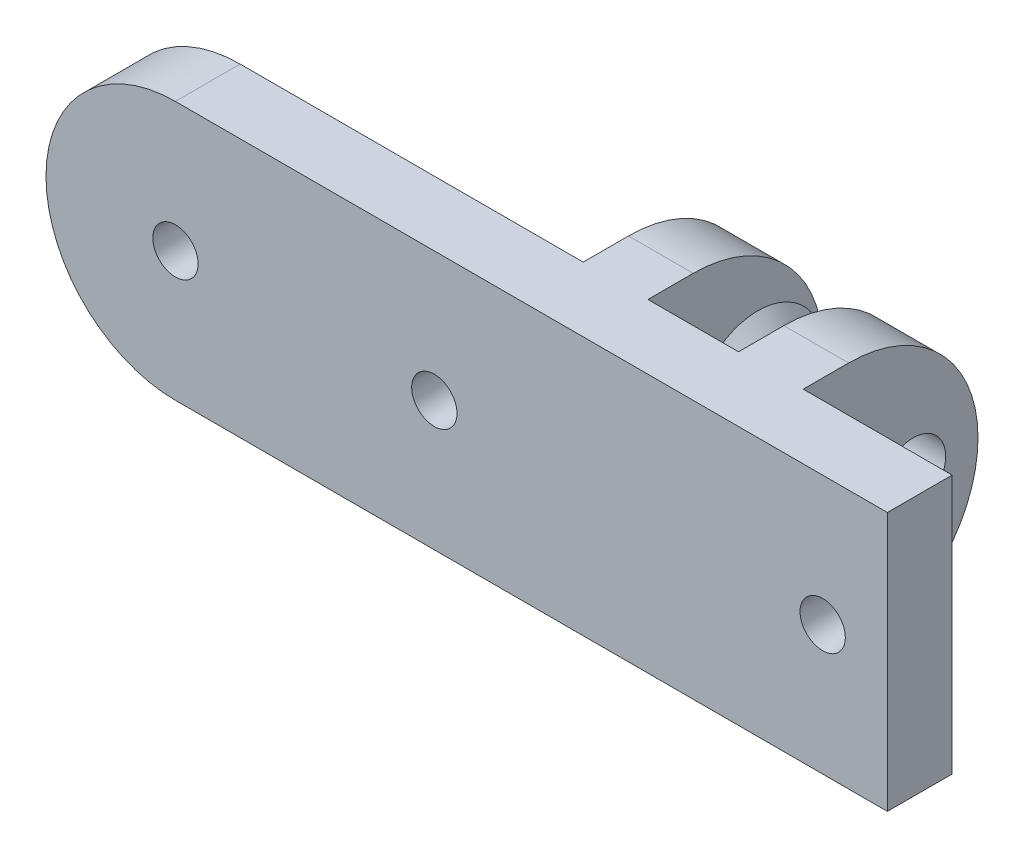
ISO-10303-21;
HEADER;
FILE_DESCRIPTION(('STEP AP214'),'2;1');
FILE_NAME('part.step','',(''),(''),'','','');
FILE_SCHEMA(('AUTOMOTIVE_DESIGN { 1 0 10303 214 1 1 1 1 }'));
ENDSEC;
DATA;
#1=APPLICATION_CONTEXT('core data for automotive mechanical design processes');
#2=APPLICATION_PROTOCOL_DEFINITION('international standard','automotive_design',2000,#1);
#3=PRODUCT_CONTEXT('',#1,'mechanical');
#4=PRODUCT('Part','Part','',(#3));
#5=PRODUCT_RELATED_PRODUCT_CATEGORY('part','',(#4));
#6=PRODUCT_DEFINITION_FORMATION('','',#4);
#7=PRODUCT_DEFINITION_CONTEXT('part definition',#1,'design');
#8=PRODUCT_DEFINITION('design','',#6,#7);
#9=PRODUCT_DEFINITION_SHAPE('','',#8);
#10=(LENGTH_UNIT() NAMED_UNIT(*) SI_UNIT(.MILLI.,.METRE.));
#11=(NAMED_UNIT(*) PLANE_ANGLE_UNIT() SI_UNIT($,.RADIAN.));
#12=(NAMED_UNIT(*) SI_UNIT($,.STERADIAN.) SOLID_ANGLE_UNIT());
#13=UNCERTAINTY_MEASURE_WITH_UNIT(LENGTH_MEASURE(1.E-05),#10,'distance_accuracy_value','');
#14=(GEOMETRIC_REPRESENTATION_CONTEXT(3) GLOBAL_UNCERTAINTY_ASSIGNED_CONTEXT((#13)) GLOBAL_UNIT_ASSIGNED_CONTEXT((#10,
#11,#12)) REPRESENTATION_CONTEXT('',''));
#15=CARTESIAN_POINT('',(0.,0.,0.));
#16=DIRECTION('',(0.,0.,1.));
#17=DIRECTION('',(1.,0.,0.));
#18=AXIS2_PLACEMENT_3D('',#15,#16,#17);
#19=CARTESIAN_POINT('',(0.,0.,0.));
#20=DIRECTION('',(0.,0.,1.));
#21=DIRECTION('',(1.,0.,0.));
#22=AXIS2_PLACEMENT_3D('',#19,#20,#21);
#23=PLANE('',#22);
#24=CARTESIAN_POINT('',(-35.,0.,0.));
#25=DIRECTION('',(0.,0.,1.));
#26=DIRECTION('',(1.,0.,0.));
#27=AXIS2_PLACEMENT_3D('',#24,#25,#26);
#28=CIRCLE('',#27,1.75);
#29=CARTESIAN_POINT('',(-33.25,0.,0.));
#30=VERTEX_POINT('',#29);
#31=EDGE_CURVE('E170',#30,#30,#28,.T.);
#32=ORIENTED_EDGE('',*,*,#31,.T.);
#33=EDGE_LOOP('',(#32));
#34=FACE_BOUND('',#33,.T.);
#35=CARTESIAN_POINT('',(-15.,0.,0.));
#36=DIRECTION('',(0.,0.,1.));
#37=DIRECTION('',(1.,0.,0.));
#38=AXIS2_PLACEMENT_3D('',#35,#36,#37);
#39=CIRCLE('',#38,1.75);
#40=CARTESIAN_POINT('',(-13.25,0.,0.));
#41=VERTEX_POINT('',#40);
#42=EDGE_CURVE('E194',#41,#41,#39,.T.);
#43=ORIENTED_EDGE('',*,*,#42,.T.);
#44=EDGE_LOOP('',(#43));
#45=FACE_BOUND('',#44,.T.);
#46=CARTESIAN_POINT('',(-35.,0.,0.));
#47=DIRECTION('',(0.,0.,1.));
#48=DIRECTION('',(1.,0.,0.));
#49=AXIS2_PLACEMENT_3D('',#46,#47,#48);
#50=CIRCLE('',#49,10.);
#51=CARTESIAN_POINT('',(-35.,10.,0.));
#52=VERTEX_POINT('',#51);
#53=CARTESIAN_POINT('',(-35.,-10.,0.));
#54=VERTEX_POINT('',#53);
#55=EDGE_CURVE('E259',#52,#54,#50,.T.);
#56=ORIENTED_EDGE('',*,*,#55,.F.);
#57=DIRECTION('',(1.,0.,0.));
#58=VECTOR('',#57,1.);
#59=CARTESIAN_POINT('',(0.,10.,0.));
#60=LINE('',#59,#58);
#61=CARTESIAN_POINT('',(-8.5,10.,0.));
#62=VERTEX_POINT('',#61);
#63=EDGE_CURVE('E178',#52,#62,#60,.T.);
#64=ORIENTED_EDGE('',*,*,#63,.T.);
#65=DIRECTION('',(0.,1.,0.));
#66=VECTOR('',#65,1.);
#67=CARTESIAN_POINT('',(-8.5,10.,0.));
#68=LINE('',#67,#66);
#69=CARTESIAN_POINT('',(-8.5,-10.,0.));
#70=VERTEX_POINT('',#69);
#71=EDGE_CURVE('E294',#70,#62,#68,.T.);
#72=ORIENTED_EDGE('',*,*,#71,.F.);
#73=DIRECTION('',(1.,0.,0.));
#74=VECTOR('',#73,1.);
#75=CARTESIAN_POINT('',(0.,-10.,0.));
#76=LINE('',#75,#74);
#77=EDGE_CURVE('E199',#54,#70,#76,.T.);
#78=ORIENTED_EDGE('',*,*,#77,.F.);
#79=EDGE_LOOP('',(#56,#64,#72,#78));
#80=FACE_BOUND('',#79,.T.);
#81=ADVANCED_FACE('F62',(#34,#45,#80),#23,.F.);
#82=CARTESIAN_POINT('',(0.,0.,5.));
#83=DIRECTION('',(0.,0.,1.));
#84=DIRECTION('',(1.,0.,0.));
#85=AXIS2_PLACEMENT_3D('',#82,#83,#84);
#86=PLANE('',#85);
#87=CARTESIAN_POINT('',(-35.,0.,5.));
#88=DIRECTION('',(0.,0.,1.));
#89=DIRECTION('',(1.,0.,0.));
#90=AXIS2_PLACEMENT_3D('',#87,#88,#89);
#91=CIRCLE('',#90,1.75);
#92=CARTESIAN_POINT('',(-33.25,0.,5.));
#93=VERTEX_POINT('',#92);
#94=EDGE_CURVE('E179',#93,#93,#91,.T.);
#95=ORIENTED_EDGE('',*,*,#94,.F.);
#96=EDGE_LOOP('',(#95));
#97=FACE_BOUND('',#96,.T.);
#98=CARTESIAN_POINT('',(-15.,0.,5.));
#99=DIRECTION('',(0.,0.,1.));
#100=DIRECTION('',(1.,0.,0.));
#101=AXIS2_PLACEMENT_3D('',#98,#99,#100);
#102=CIRCLE('',#101,1.75);
#103=CARTESIAN_POINT('',(-13.25,0.,5.));
#104=VERTEX_POINT('',#103);
#105=EDGE_CURVE('E211',#104,#104,#102,.T.);
#106=ORIENTED_EDGE('',*,*,#105,.F.);
#107=EDGE_LOOP('',(#106));
#108=FACE_BOUND('',#107,.T.);
#109=CARTESIAN_POINT('',(15.,0.,5.));
#110=DIRECTION('',(0.,0.,1.));
#111=DIRECTION('',(1.,0.,0.));
#112=AXIS2_PLACEMENT_3D('',#109,#110,#111);
#113=CIRCLE('',#112,1.75);
#114=CARTESIAN_POINT('',(16.75,0.,5.));
#115=VERTEX_POINT('',#114);
#116=EDGE_CURVE('E185',#115,#115,#113,.T.);
#117=ORIENTED_EDGE('',*,*,#116,.F.);
#118=EDGE_LOOP('',(#117));
#119=FACE_BOUND('',#118,.T.);
#120=DIRECTION('',(1.,0.,0.));
#121=VECTOR('',#120,1.);
#122=CARTESIAN_POINT('',(0.,10.,5.));
#123=LINE('',#122,#121);
#124=CARTESIAN_POINT('',(-35.,10.,5.));
#125=VERTEX_POINT('',#124);
#126=CARTESIAN_POINT('',(20.,10.,5.));
#127=VERTEX_POINT('',#126);
#128=EDGE_CURVE('E175',#125,#127,#123,.T.);
#129=ORIENTED_EDGE('',*,*,#128,.F.);
#130=CARTESIAN_POINT('',(-35.,0.,5.));
#131=DIRECTION('',(0.,0.,1.));
#132=DIRECTION('',(1.,0.,0.));
#133=AXIS2_PLACEMENT_3D('',#130,#131,#132);
#134=CIRCLE('',#133,10.);
#135=CARTESIAN_POINT('',(-35.,-10.,5.));
#136=VERTEX_POINT('',#135);
#137=EDGE_CURVE('E162',#125,#136,#134,.T.);
#138=ORIENTED_EDGE('',*,*,#137,.T.);
#139=DIRECTION('',(1.,0.,0.));
#140=VECTOR('',#139,1.);
#141=CARTESIAN_POINT('',(0.,-10.,5.));
#142=LINE('',#141,#140);
#143=CARTESIAN_POINT('',(20.,-10.,5.));
#144=VERTEX_POINT('',#143);
#145=EDGE_CURVE('E190',#136,#144,#142,.T.);
#146=ORIENTED_EDGE('',*,*,#145,.T.);
#147=DIRECTION('',(0.,1.,0.));
#148=VECTOR('',#147,1.);
#149=CARTESIAN_POINT('',(20.,0.,5.));
#150=LINE('',#149,#148);
#151=EDGE_CURVE('E183',#144,#127,#150,.T.);
#152=ORIENTED_EDGE('',*,*,#151,.T.);
#153=EDGE_LOOP('',(#129,#138,#146,#152));
#154=FACE_BOUND('',#153,.T.);
#155=ADVANCED_FACE('F181',(#97,#108,#119,#154),#86,.T.);
#156=CARTESIAN_POINT('',(0.,10.,5.));
#157=DIRECTION('',(0.,1.,0.));
#158=DIRECTION('',(0.,0.,1.));
#159=AXIS2_PLACEMENT_3D('',#156,#157,#158);
#160=PLANE('',#159);
#161=ORIENTED_EDGE('',*,*,#63,.F.);
#162=DIRECTION('',(0.,0.,1.));
#163=VECTOR('',#162,1.);
#164=CARTESIAN_POINT('',(-35.,10.,-0.5));
#165=LINE('',#164,#163);
#166=EDGE_CURVE('E165',#52,#125,#165,.T.);
#167=ORIENTED_EDGE('',*,*,#166,.T.);
#168=ORIENTED_EDGE('',*,*,#128,.T.);
#169=DIRECTION('',(0.,0.,-1.));
#170=VECTOR('',#169,1.);
#171=CARTESIAN_POINT('',(20.,10.,5.));
#172=LINE('',#171,#170);
#173=CARTESIAN_POINT('',(20.,10.,0.));
#174=VERTEX_POINT('',#173);
#175=EDGE_CURVE('E188',#127,#174,#172,.T.);
#176=ORIENTED_EDGE('',*,*,#175,.T.);
#177=CARTESIAN_POINT('',(8.5,10.,0.));
#178=VERTEX_POINT('',#177);
#179=EDGE_CURVE('E205',#178,#174,#60,.T.);
#180=ORIENTED_EDGE('',*,*,#179,.F.);
#181=DIRECTION('',(0.,0.,1.));
#182=VECTOR('',#181,1.);
#183=CARTESIAN_POINT('',(8.5,10.,-13.5));
#184=LINE('',#183,#182);
#185=CARTESIAN_POINT('',(8.5,10.,-3.5));
#186=VERTEX_POINT('',#185);
#187=EDGE_CURVE('E292',#186,#178,#184,.T.);
#188=ORIENTED_EDGE('',*,*,#187,.F.);
#189=DIRECTION('',(1.,0.,0.));
#190=VECTOR('',#189,1.);
#191=CARTESIAN_POINT('',(3.5,10.,-3.5));
#192=LINE('',#191,#190);
#193=CARTESIAN_POINT('',(3.5,10.,-3.5));
#194=VERTEX_POINT('',#193);
#195=EDGE_CURVE('E226',#186,#194,#192,.F.);
#196=ORIENTED_EDGE('',*,*,#195,.T.);
#197=DIRECTION('',(0.,0.,1.));
#198=VECTOR('',#197,1.);
#199=CARTESIAN_POINT('',(3.5,10.,-13.5));
#200=LINE('',#199,#198);
#201=CARTESIAN_POINT('',(3.5,10.,0.));
#202=VERTEX_POINT('',#201);
#203=EDGE_CURVE('E286',#194,#202,#200,.T.);
#204=ORIENTED_EDGE('',*,*,#203,.T.);
#205=CARTESIAN_POINT('',(-3.5,10.,0.));
#206=VERTEX_POINT('',#205);
#207=EDGE_CURVE('E208',#206,#202,#60,.T.);
#208=ORIENTED_EDGE('',*,*,#207,.F.);
#209=DIRECTION('',(0.,0.,1.));
#210=VECTOR('',#209,1.);
#211=CARTESIAN_POINT('',(-3.5,10.,-13.5));
#212=LINE('',#211,#210);
#213=CARTESIAN_POINT('',(-3.5,10.,-3.5));
#214=VERTEX_POINT('',#213);
#215=EDGE_CURVE('E303',#214,#206,#212,.T.);
#216=ORIENTED_EDGE('',*,*,#215,.F.);
#217=DIRECTION('',(1.,0.,0.));
#218=VECTOR('',#217,1.);
#219=CARTESIAN_POINT('',(-8.5,10.,-3.5));
#220=LINE('',#219,#218);
#221=CARTESIAN_POINT('',(-8.5,10.,-3.5));
#222=VERTEX_POINT('',#221);
#223=EDGE_CURVE('E243',#214,#222,#220,.F.);
#224=ORIENTED_EDGE('',*,*,#223,.T.);
#225=DIRECTION('',(0.,0.,1.));
#226=VECTOR('',#225,1.);
#227=CARTESIAN_POINT('',(-8.5,10.,-13.5));
#228=LINE('',#227,#226);
#229=EDGE_CURVE('E198',#222,#62,#228,.T.);
#230=ORIENTED_EDGE('',*,*,#229,.T.);
#231=EDGE_LOOP('',(#161,#167,#168,#176,#180,#188,#196,#204,#208,#216,#224,#230));
#232=FACE_BOUND('',#231,.T.);
#233=ADVANCED_FACE('F173',(#232),#160,.T.);
#234=CARTESIAN_POINT('',(0.,-10.,5.));
#235=DIRECTION('',(0.,1.,0.));
#236=DIRECTION('',(0.,0.,1.));
#237=AXIS2_PLACEMENT_3D('',#234,#235,#236);
#238=PLANE('',#237);
#239=DIRECTION('',(0.,0.,1.));
#240=VECTOR('',#239,1.);
#241=CARTESIAN_POINT('',(-35.,-10.,-0.5));
#242=LINE('',#241,#240);
#243=EDGE_CURVE('E78',#54,#136,#242,.T.);
#244=ORIENTED_EDGE('',*,*,#243,.F.);
#245=ORIENTED_EDGE('',*,*,#77,.T.);
#246=DIRECTION('',(0.,0.,1.));
#247=VECTOR('',#246,1.);
#248=CARTESIAN_POINT('',(-8.5,-10.,-13.5));
#249=LINE('',#248,#247);
#250=CARTESIAN_POINT('',(-8.5,-10.,-3.5));
#251=VERTEX_POINT('',#250);
#252=EDGE_CURVE('E299',#251,#70,#249,.T.);
#253=ORIENTED_EDGE('',*,*,#252,.F.);
#254=DIRECTION('',(-1.,0.,0.));
#255=VECTOR('',#254,1.);
#256=CARTESIAN_POINT('',(0.,-10.,-3.5));
#257=LINE('',#256,#255);
#258=CARTESIAN_POINT('',(-3.5,-10.,-3.5));
#259=VERTEX_POINT('',#258);
#260=EDGE_CURVE('E12',#251,#259,#257,.F.);
#261=ORIENTED_EDGE('',*,*,#260,.T.);
#262=DIRECTION('',(0.,0.,1.));
#263=VECTOR('',#262,1.);
#264=CARTESIAN_POINT('',(-3.5,-10.,-13.5));
#265=LINE('',#264,#263);
#266=CARTESIAN_POINT('',(-3.5,-10.,0.));
#267=VERTEX_POINT('',#266);
#268=EDGE_CURVE('E301',#259,#267,#265,.T.);
#269=ORIENTED_EDGE('',*,*,#268,.T.);
#270=CARTESIAN_POINT('',(3.5,-10.,0.));
#271=VERTEX_POINT('',#270);
#272=EDGE_CURVE('E202',#267,#271,#76,.T.);
#273=ORIENTED_EDGE('',*,*,#272,.T.);
#274=DIRECTION('',(0.,0.,1.));
#275=VECTOR('',#274,1.);
#276=CARTESIAN_POINT('',(3.5,-10.,-13.5));
#277=LINE('',#276,#275);
#278=CARTESIAN_POINT('',(3.5,-10.,-3.5));
#279=VERTEX_POINT('',#278);
#280=EDGE_CURVE('E288',#279,#271,#277,.T.);
#281=ORIENTED_EDGE('',*,*,#280,.F.);
#282=DIRECTION('',(-1.,0.,0.));
#283=VECTOR('',#282,1.);
#284=CARTESIAN_POINT('',(0.,-10.,-3.5));
#285=LINE('',#284,#283);
#286=CARTESIAN_POINT('',(8.5,-10.,-3.5));
#287=VERTEX_POINT('',#286);
#288=EDGE_CURVE('E233',#279,#287,#285,.F.);
#289=ORIENTED_EDGE('',*,*,#288,.T.);
#290=DIRECTION('',(0.,0.,1.));
#291=VECTOR('',#290,1.);
#292=CARTESIAN_POINT('',(8.5,-10.,-13.5));
#293=LINE('',#292,#291);
#294=CARTESIAN_POINT('',(8.5,-10.,0.));
#295=VERTEX_POINT('',#294);
#296=EDGE_CURVE('E290',#287,#295,#293,.T.);
#297=ORIENTED_EDGE('',*,*,#296,.T.);
#298=CARTESIAN_POINT('',(20.,-10.,0.));
#299=VERTEX_POINT('',#298);
#300=EDGE_CURVE('E197',#295,#299,#76,.T.);
#301=ORIENTED_EDGE('',*,*,#300,.T.);
#302=DIRECTION('',(0.,0.,-1.));
#303=VECTOR('',#302,1.);
#304=CARTESIAN_POINT('',(20.,-10.,5.));
#305=LINE('',#304,#303);
#306=EDGE_CURVE('E213',#144,#299,#305,.T.);
#307=ORIENTED_EDGE('',*,*,#306,.F.);
#308=ORIENTED_EDGE('',*,*,#145,.F.);
#309=EDGE_LOOP('',(#244,#245,#253,#261,#269,#273,#281,#289,#297,#301,#307,#308));
#310=FACE_BOUND('',#309,.T.);
#311=ADVANCED_FACE('F311',(#310),#238,.F.);
#312=CARTESIAN_POINT('',(-3.5,10.,-13.5));
#313=DIRECTION('',(-1.,0.,0.));
#314=DIRECTION('',(0.,-1.,0.));
#315=AXIS2_PLACEMENT_3D('',#312,#313,#314);
#316=PLANE('',#315);
#317=CARTESIAN_POINT('',(-3.5,0.,-8.5));
#318=DIRECTION('',(-1.,0.,0.));
#319=DIRECTION('',(0.,-1.,0.));
#320=AXIS2_PLACEMENT_3D('',#317,#318,#319);
#321=CIRCLE('',#320,5.);
#322=CARTESIAN_POINT('',(-3.5,0.,-13.5));
#323=VERTEX_POINT('',#322);
#324=EDGE_CURVE('E216',#323,#323,#321,.T.);
#325=ORIENTED_EDGE('',*,*,#324,.T.);
#326=CARTESIAN_POINT('',(-3.5,0.,-3.5));
#327=DIRECTION('',(-1.,0.,0.));
#328=DIRECTION('',(0.,-1.,0.));
#329=AXIS2_PLACEMENT_3D('',#326,#327,#328);
#330=CIRCLE('',#329,10.);
#331=EDGE_CURVE('E241',#323,#214,#330,.F.);
#332=ORIENTED_EDGE('',*,*,#331,.T.);
#333=ORIENTED_EDGE('',*,*,#215,.T.);
#334=DIRECTION('',(0.,-1.,0.));
#335=VECTOR('',#334,1.);
#336=CARTESIAN_POINT('',(-3.5,10.,0.));
#337=LINE('',#336,#335);
#338=EDGE_CURVE('E296',#206,#267,#337,.T.);
#339=ORIENTED_EDGE('',*,*,#338,.T.);
#340=ORIENTED_EDGE('',*,*,#268,.F.);
#341=CARTESIAN_POINT('',(-3.5,0.,-3.5));
#342=DIRECTION('',(-1.,0.,0.));
#343=DIRECTION('',(0.,-1.,0.));
#344=AXIS2_PLACEMENT_3D('',#341,#342,#343);
#345=CIRCLE('',#344,10.);
#346=EDGE_CURVE('E235',#259,#323,#345,.F.);
#347=ORIENTED_EDGE('',*,*,#346,.T.);
#348=EDGE_LOOP('',(#325,#332,#333,#339,#340,#347));
#349=FACE_BOUND('',#348,.T.);
#350=ADVANCED_FACE('F402',(#349),#316,.F.);
#351=CARTESIAN_POINT('',(3.5,10.,-13.5));
#352=DIRECTION('',(1.,0.,0.));
#353=DIRECTION('',(0.,1.,0.));
#354=AXIS2_PLACEMENT_3D('',#351,#352,#353);
#355=PLANE('',#354);
#356=ORIENTED_EDGE('',*,*,#203,.F.);
#357=CARTESIAN_POINT('',(3.5,0.,-3.5));
#358=DIRECTION('',(1.,0.,0.));
#359=DIRECTION('',(0.,1.,0.));
#360=AXIS2_PLACEMENT_3D('',#357,#358,#359);
#361=CIRCLE('',#360,10.);
#362=CARTESIAN_POINT('',(3.5,0.,-13.5));
#363=VERTEX_POINT('',#362);
#364=EDGE_CURVE('E231',#194,#363,#361,.F.);
#365=ORIENTED_EDGE('',*,*,#364,.T.);
#366=CARTESIAN_POINT('',(3.5,0.,-8.5));
#367=DIRECTION('',(1.,0.,0.));
#368=DIRECTION('',(0.,1.,0.));
#369=AXIS2_PLACEMENT_3D('',#366,#367,#368);
#370=CIRCLE('',#369,5.);
#371=EDGE_CURVE('E219',#363,#363,#370,.T.);
#372=ORIENTED_EDGE('',*,*,#371,.T.);
#373=CARTESIAN_POINT('',(3.5,0.,-3.5));
#374=DIRECTION('',(1.,0.,0.));
#375=DIRECTION('',(0.,1.,0.));
#376=AXIS2_PLACEMENT_3D('',#373,#374,#375);
#377=CIRCLE('',#376,10.);
#378=EDGE_CURVE('E229',#363,#279,#377,.F.);
#379=ORIENTED_EDGE('',*,*,#378,.T.);
#380=ORIENTED_EDGE('',*,*,#280,.T.);
#381=DIRECTION('',(0.,1.,0.));
#382=VECTOR('',#381,1.);
#383=CARTESIAN_POINT('',(3.5,10.,0.));
#384=LINE('',#383,#382);
#385=EDGE_CURVE('E283',#271,#202,#384,.T.);
#386=ORIENTED_EDGE('',*,*,#385,.T.);
#387=EDGE_LOOP('',(#356,#365,#372,#379,#380,#386));
#388=FACE_BOUND('',#387,.T.);
#389=ADVANCED_FACE('F331',(#388),#355,.F.);
#390=CARTESIAN_POINT('',(15.,0.,0.));
#391=DIRECTION('',(0.,0.,1.));
#392=DIRECTION('',(1.,0.,0.));
#393=AXIS2_PLACEMENT_3D('',#390,#391,#392);
#394=CIRCLE('',#393,1.75);
#395=CARTESIAN_POINT('',(16.75,0.,0.));
#396=VERTEX_POINT('',#395);
#397=EDGE_CURVE('E207',#396,#396,#394,.T.);
#398=ORIENTED_EDGE('',*,*,#397,.T.);
#399=EDGE_LOOP('',(#398));
#400=FACE_BOUND('',#399,.T.);
#401=DIRECTION('',(0.,-1.,0.));
#402=VECTOR('',#401,1.);
#403=CARTESIAN_POINT('',(8.5,10.,0.));
#404=LINE('',#403,#402);
#405=EDGE_CURVE('E280',#178,#295,#404,.T.);
#406=ORIENTED_EDGE('',*,*,#405,.F.);
#407=ORIENTED_EDGE('',*,*,#179,.T.);
#408=DIRECTION('',(0.,1.,0.));
#409=VECTOR('',#408,1.);
#410=CARTESIAN_POINT('',(20.,0.,0.));
#411=LINE('',#410,#409);
#412=EDGE_CURVE('E201',#299,#174,#411,.T.);
#413=ORIENTED_EDGE('',*,*,#412,.F.);
#414=ORIENTED_EDGE('',*,*,#300,.F.);
#415=EDGE_LOOP('',(#406,#407,#413,#414));
#416=FACE_BOUND('',#415,.T.);
#417=ADVANCED_FACE('F317',(#400,#416),#23,.F.);
#418=ORIENTED_EDGE('',*,*,#385,.F.);
#419=ORIENTED_EDGE('',*,*,#272,.F.);
#420=ORIENTED_EDGE('',*,*,#338,.F.);
#421=ORIENTED_EDGE('',*,*,#207,.T.);
#422=EDGE_LOOP('',(#418,#419,#420,#421));
#423=FACE_BOUND('',#422,.T.);
#424=ADVANCED_FACE('F325',(#423),#23,.F.);
#425=CARTESIAN_POINT('',(20.,0.,5.));
#426=DIRECTION('',(-1.,0.,0.));
#427=DIRECTION('',(0.,0.,1.));
#428=AXIS2_PLACEMENT_3D('',#425,#426,#427);
#429=PLANE('',#428);
#430=ORIENTED_EDGE('',*,*,#412,.T.);
#431=ORIENTED_EDGE('',*,*,#175,.F.);
#432=ORIENTED_EDGE('',*,*,#151,.F.);
#433=ORIENTED_EDGE('',*,*,#306,.T.);
#434=EDGE_LOOP('',(#430,#431,#432,#433));
#435=FACE_BOUND('',#434,.T.);
#436=ADVANCED_FACE('F310',(#435),#429,.F.);
#437=CARTESIAN_POINT('',(-15.,0.,5.));
#438=DIRECTION('',(0.,0.,-1.));
#439=DIRECTION('',(-1.,0.,0.));
#440=AXIS2_PLACEMENT_3D('',#437,#438,#439);
#441=CYLINDRICAL_SURFACE('',#440,1.75);
#442=ORIENTED_EDGE('',*,*,#105,.T.);
#443=EDGE_LOOP('',(#442));
#444=FACE_BOUND('',#443,.T.);
#445=ORIENTED_EDGE('',*,*,#42,.F.);
#446=EDGE_LOOP('',(#445));
#447=FACE_BOUND('',#446,.T.);
#448=ADVANCED_FACE('F391',(#444,#447),#441,.F.);
#449=CARTESIAN_POINT('',(15.,0.,5.));
#450=DIRECTION('',(0.,0.,-1.));
#451=DIRECTION('',(-1.,0.,0.));
#452=AXIS2_PLACEMENT_3D('',#449,#450,#451);
#453=CYLINDRICAL_SURFACE('',#452,1.75);
#454=ORIENTED_EDGE('',*,*,#116,.T.);
#455=EDGE_LOOP('',(#454));
#456=FACE_BOUND('',#455,.T.);
#457=ORIENTED_EDGE('',*,*,#397,.F.);
#458=EDGE_LOOP('',(#457));
#459=FACE_BOUND('',#458,.T.);
#460=ADVANCED_FACE('F396',(#456,#459),#453,.F.);
#461=CARTESIAN_POINT('',(-8.5,10.,-13.5));
#462=DIRECTION('',(1.,0.,0.));
#463=DIRECTION('',(0.,1.,0.));
#464=AXIS2_PLACEMENT_3D('',#461,#462,#463);
#465=PLANE('',#464);
#466=CARTESIAN_POINT('',(-8.5,0.,-8.5));
#467=DIRECTION('',(1.,0.,0.));
#468=DIRECTION('',(0.,1.,0.));
#469=AXIS2_PLACEMENT_3D('',#466,#467,#468);
#470=CIRCLE('',#469,2.5);
#471=CARTESIAN_POINT('',(-8.5,2.5,-8.5));
#472=VERTEX_POINT('',#471);
#473=EDGE_CURVE('E277',#472,#472,#470,.T.);
#474=ORIENTED_EDGE('',*,*,#473,.T.);
#475=EDGE_LOOP('',(#474));
#476=FACE_BOUND('',#475,.T.);
#477=ORIENTED_EDGE('',*,*,#229,.F.);
#478=CARTESIAN_POINT('',(-8.5,0.,-3.5));
#479=DIRECTION('',(1.,0.,0.));
#480=DIRECTION('',(0.,1.,0.));
#481=AXIS2_PLACEMENT_3D('',#478,#479,#480);
#482=CIRCLE('',#481,10.);
#483=CARTESIAN_POINT('',(-8.5,0.,-13.5));
#484=VERTEX_POINT('',#483);
#485=EDGE_CURVE('E71',#222,#484,#482,.F.);
#486=ORIENTED_EDGE('',*,*,#485,.T.);
#487=CARTESIAN_POINT('',(-8.5,0.,-3.5));
#488=DIRECTION('',(1.,0.,0.));
#489=DIRECTION('',(0.,1.,0.));
#490=AXIS2_PLACEMENT_3D('',#487,#488,#489);
#491=CIRCLE('',#490,10.);
#492=EDGE_CURVE('E86',#484,#251,#491,.F.);
#493=ORIENTED_EDGE('',*,*,#492,.T.);
#494=ORIENTED_EDGE('',*,*,#252,.T.);
#495=ORIENTED_EDGE('',*,*,#71,.T.);
#496=EDGE_LOOP('',(#477,#486,#493,#494,#495));
#497=FACE_BOUND('',#496,.T.);
#498=ADVANCED_FACE('F248',(#476,#497),#465,.F.);
#499=CARTESIAN_POINT('',(8.5,10.,-13.5));
#500=DIRECTION('',(-1.,0.,0.));
#501=DIRECTION('',(0.,-1.,0.));
#502=AXIS2_PLACEMENT_3D('',#499,#500,#501);
#503=PLANE('',#502);
#504=CARTESIAN_POINT('',(8.5,0.,-8.5));
#505=DIRECTION('',(1.,0.,0.));
#506=DIRECTION('',(0.,1.,0.));
#507=AXIS2_PLACEMENT_3D('',#504,#505,#506);
#508=CIRCLE('',#507,2.5);
#509=CARTESIAN_POINT('',(8.5,2.5,-8.5));
#510=VERTEX_POINT('',#509);
#511=EDGE_CURVE('E274',#510,#510,#508,.T.);
#512=ORIENTED_EDGE('',*,*,#511,.F.);
#513=EDGE_LOOP('',(#512));
#514=FACE_BOUND('',#513,.T.);
#515=CARTESIAN_POINT('',(8.5,0.,-3.5));
#516=DIRECTION('',(-1.,0.,0.));
#517=DIRECTION('',(0.,-1.,0.));
#518=AXIS2_PLACEMENT_3D('',#515,#516,#517);
#519=CIRCLE('',#518,10.);
#520=CARTESIAN_POINT('',(8.5,0.,-13.5));
#521=VERTEX_POINT('',#520);
#522=EDGE_CURVE('E222',#287,#521,#519,.F.);
#523=ORIENTED_EDGE('',*,*,#522,.T.);
#524=CARTESIAN_POINT('',(8.5,0.,-3.5));
#525=DIRECTION('',(-1.,0.,0.));
#526=DIRECTION('',(0.,-1.,0.));
#527=AXIS2_PLACEMENT_3D('',#524,#525,#526);
#528=CIRCLE('',#527,10.);
#529=EDGE_CURVE('E224',#521,#186,#528,.F.);
#530=ORIENTED_EDGE('',*,*,#529,.T.);
#531=ORIENTED_EDGE('',*,*,#187,.T.);
#532=ORIENTED_EDGE('',*,*,#405,.T.);
#533=ORIENTED_EDGE('',*,*,#296,.F.);
#534=EDGE_LOOP('',(#523,#530,#531,#532,#533));
#535=FACE_BOUND('',#534,.T.);
#536=ADVANCED_FACE('F341',(#514,#535),#503,.F.);
#537=CARTESIAN_POINT('',(-16.5,0.,-8.5));
#538=DIRECTION('',(1.,0.,0.));
#539=DIRECTION('',(0.,1.,0.));
#540=AXIS2_PLACEMENT_3D('',#537,#538,#539);
#541=CYLINDRICAL_SURFACE('',#540,2.5);
#542=ORIENTED_EDGE('',*,*,#511,.T.);
#543=EDGE_LOOP('',(#542));
#544=FACE_BOUND('',#543,.T.);
#545=CARTESIAN_POINT('',(2.5,0.,-8.5));
#546=DIRECTION('',(-1.,0.,0.));
#547=DIRECTION('',(0.,-1.,0.));
#548=AXIS2_PLACEMENT_3D('',#545,#546,#547);
#549=CIRCLE('',#548,2.5);
#550=CARTESIAN_POINT('',(2.5,-2.5,-8.5));
#551=VERTEX_POINT('',#550);
#552=EDGE_CURVE('E268',#551,#551,#549,.T.);
#553=ORIENTED_EDGE('',*,*,#552,.T.);
#554=EDGE_LOOP('',(#553));
#555=FACE_BOUND('',#554,.T.);
#556=ADVANCED_FACE('F362',(#544,#555),#541,.F.);
#557=ORIENTED_EDGE('',*,*,#473,.F.);
#558=EDGE_LOOP('',(#557));
#559=FACE_BOUND('',#558,.T.);
#560=CARTESIAN_POINT('',(-2.5,0.,-8.5));
#561=DIRECTION('',(1.,0.,0.));
#562=DIRECTION('',(0.,0.,-1.));
#563=AXIS2_PLACEMENT_3D('',#560,#561,#562);
#564=CIRCLE('',#563,2.5);
#565=CARTESIAN_POINT('',(-2.5,0.,-11.));
#566=VERTEX_POINT('',#565);
#567=EDGE_CURVE('E239',#566,#566,#564,.T.);
#568=ORIENTED_EDGE('',*,*,#567,.T.);
#569=EDGE_LOOP('',(#568));
#570=FACE_BOUND('',#569,.T.);
#571=ADVANCED_FACE('F358',(#559,#570),#541,.F.);
#572=CARTESIAN_POINT('',(2.5,0.,-8.5));
#573=DIRECTION('',(-1.,0.,0.));
#574=DIRECTION('',(0.,-1.,0.));
#575=AXIS2_PLACEMENT_3D('',#572,#573,#574);
#576=PLANE('',#575);
#577=CARTESIAN_POINT('',(2.5,0.,-8.5));
#578=DIRECTION('',(-1.,0.,0.));
#579=DIRECTION('',(0.,-1.,0.));
#580=AXIS2_PLACEMENT_3D('',#577,#578,#579);
#581=CIRCLE('',#580,4.);
#582=CARTESIAN_POINT('',(2.5,-4.,-8.5));
#583=VERTEX_POINT('',#582);
#584=EDGE_CURVE('E271',#583,#583,#581,.T.);
#585=ORIENTED_EDGE('',*,*,#584,.T.);
#586=EDGE_LOOP('',(#585));
#587=FACE_BOUND('',#586,.T.);
#588=ORIENTED_EDGE('',*,*,#552,.F.);
#589=EDGE_LOOP('',(#588));
#590=FACE_BOUND('',#589,.T.);
#591=ADVANCED_FACE('F354',(#587,#590),#576,.T.);
#592=CARTESIAN_POINT('',(-2.5,0.,-8.5));
#593=DIRECTION('',(1.,0.,0.));
#594=DIRECTION('',(0.,0.,-1.));
#595=AXIS2_PLACEMENT_3D('',#592,#593,#594);
#596=PLANE('',#595);
#597=CARTESIAN_POINT('',(-2.5,0.,-8.5));
#598=DIRECTION('',(1.,0.,0.));
#599=DIRECTION('',(0.,0.,-1.));
#600=AXIS2_PLACEMENT_3D('',#597,#598,#599);
#601=CIRCLE('',#600,4.);
#602=CARTESIAN_POINT('',(-2.5,0.,-12.5));
#603=VERTEX_POINT('',#602);
#604=EDGE_CURVE('E265',#603,#603,#601,.T.);
#605=ORIENTED_EDGE('',*,*,#604,.T.);
#606=EDGE_LOOP('',(#605));
#607=FACE_BOUND('',#606,.T.);
#608=ORIENTED_EDGE('',*,*,#567,.F.);
#609=EDGE_LOOP('',(#608));
#610=FACE_BOUND('',#609,.T.);
#611=ADVANCED_FACE('F357',(#607,#610),#596,.T.);
#612=CARTESIAN_POINT('',(-2.5,0.,-8.5));
#613=DIRECTION('',(-1.,0.,0.));
#614=DIRECTION('',(0.,0.,1.));
#615=AXIS2_PLACEMENT_3D('',#612,#613,#614);
#616=CONICAL_SURFACE('',#615,4.,0.785398163397445);
#617=ORIENTED_EDGE('',*,*,#324,.F.);
#618=EDGE_LOOP('',(#617));
#619=FACE_BOUND('',#618,.T.);
#620=ORIENTED_EDGE('',*,*,#604,.F.);
#621=EDGE_LOOP('',(#620));
#622=FACE_BOUND('',#621,.T.);
#623=ADVANCED_FACE('F350',(#619,#622),#616,.T.);
#624=CARTESIAN_POINT('',(2.49999999999999,0.,-8.5));
#625=DIRECTION('',(1.,0.,0.));
#626=DIRECTION('',(0.,1.,0.));
#627=AXIS2_PLACEMENT_3D('',#624,#625,#626);
#628=CONICAL_SURFACE('',#627,4.,0.785398163397444);
#629=ORIENTED_EDGE('',*,*,#371,.F.);
#630=EDGE_LOOP('',(#629));
#631=FACE_BOUND('',#630,.T.);
#632=ORIENTED_EDGE('',*,*,#584,.F.);
#633=EDGE_LOOP('',(#632));
#634=FACE_BOUND('',#633,.T.);
#635=ADVANCED_FACE('F347',(#631,#634),#628,.T.);
#636=CARTESIAN_POINT('',(0.,0.,-3.5));
#637=DIRECTION('',(-1.,0.,0.));
#638=DIRECTION('',(0.,0.,1.));
#639=AXIS2_PLACEMENT_3D('',#636,#637,#638);
#640=CYLINDRICAL_SURFACE('',#639,10.);
#641=ORIENTED_EDGE('',*,*,#288,.F.);
#642=ORIENTED_EDGE('',*,*,#378,.F.);
#643=DIRECTION('',(-1.,0.,0.));
#644=VECTOR('',#643,1.);
#645=CARTESIAN_POINT('',(0.,0.,-13.5));
#646=LINE('',#645,#644);
#647=EDGE_CURVE('E236',#521,#363,#646,.T.);
#648=ORIENTED_EDGE('',*,*,#647,.F.);
#649=ORIENTED_EDGE('',*,*,#522,.F.);
#650=EDGE_LOOP('',(#641,#642,#648,#649));
#651=FACE_BOUND('',#650,.T.);
#652=ADVANCED_FACE('F337',(#651),#640,.T.);
#653=CARTESIAN_POINT('',(0.,0.,-3.5));
#654=DIRECTION('',(-1.,0.,0.));
#655=DIRECTION('',(0.,0.,1.));
#656=AXIS2_PLACEMENT_3D('',#653,#654,#655);
#657=CYLINDRICAL_SURFACE('',#656,10.);
#658=ORIENTED_EDGE('',*,*,#364,.F.);
#659=ORIENTED_EDGE('',*,*,#195,.F.);
#660=ORIENTED_EDGE('',*,*,#529,.F.);
#661=ORIENTED_EDGE('',*,*,#647,.T.);
#662=EDGE_LOOP('',(#658,#659,#660,#661));
#663=FACE_BOUND('',#662,.T.);
#664=ADVANCED_FACE('F344',(#663),#657,.T.);
#665=CARTESIAN_POINT('',(0.,0.,-3.5));
#666=DIRECTION('',(-1.,0.,0.));
#667=DIRECTION('',(0.,0.,1.));
#668=AXIS2_PLACEMENT_3D('',#665,#666,#667);
#669=CYLINDRICAL_SURFACE('',#668,10.);
#670=ORIENTED_EDGE('',*,*,#260,.F.);
#671=ORIENTED_EDGE('',*,*,#492,.F.);
#672=DIRECTION('',(-1.,0.,0.));
#673=VECTOR('',#672,1.);
#674=CARTESIAN_POINT('',(0.,0.,-13.5));
#675=LINE('',#674,#673);
#676=EDGE_CURVE('E66',#323,#484,#675,.T.);
#677=ORIENTED_EDGE('',*,*,#676,.F.);
#678=ORIENTED_EDGE('',*,*,#346,.F.);
#679=EDGE_LOOP('',(#670,#671,#677,#678));
#680=FACE_BOUND('',#679,.T.);
#681=ADVANCED_FACE('F64',(#680),#669,.T.);
#682=CARTESIAN_POINT('',(0.,0.,-3.5));
#683=DIRECTION('',(-1.,0.,0.));
#684=DIRECTION('',(0.,0.,1.));
#685=AXIS2_PLACEMENT_3D('',#682,#683,#684);
#686=CYLINDRICAL_SURFACE('',#685,10.);
#687=ORIENTED_EDGE('',*,*,#485,.F.);
#688=ORIENTED_EDGE('',*,*,#223,.F.);
#689=ORIENTED_EDGE('',*,*,#331,.F.);
#690=ORIENTED_EDGE('',*,*,#676,.T.);
#691=EDGE_LOOP('',(#687,#688,#689,#690));
#692=FACE_BOUND('',#691,.T.);
#693=ADVANCED_FACE('F258',(#692),#686,.T.);
#694=CARTESIAN_POINT('',(-35.,0.,-0.5));
#695=DIRECTION('',(0.,0.,1.));
#696=DIRECTION('',(1.,0.,0.));
#697=AXIS2_PLACEMENT_3D('',#694,#695,#696);
#698=CYLINDRICAL_SURFACE('',#697,10.);
#699=ORIENTED_EDGE('',*,*,#55,.T.);
#700=ORIENTED_EDGE('',*,*,#243,.T.);
#701=ORIENTED_EDGE('',*,*,#137,.F.);
#702=ORIENTED_EDGE('',*,*,#166,.F.);
#703=EDGE_LOOP('',(#699,#700,#701,#702));
#704=FACE_BOUND('',#703,.T.);
#705=ADVANCED_FACE('F164',(#704),#698,.T.);
#706=CARTESIAN_POINT('',(-35.,0.,-0.5));
#707=DIRECTION('',(0.,0.,1.));
#708=DIRECTION('',(1.,0.,0.));
#709=AXIS2_PLACEMENT_3D('',#706,#707,#708);
#710=CYLINDRICAL_SURFACE('',#709,1.75);
#711=ORIENTED_EDGE('',*,*,#94,.T.);
#712=EDGE_LOOP('',(#711));
#713=FACE_BOUND('',#712,.T.);
#714=ORIENTED_EDGE('',*,*,#31,.F.);
#715=EDGE_LOOP('',(#714));
#716=FACE_BOUND('',#715,.T.);
#717=ADVANCED_FACE('F421',(#713,#716),#710,.F.);
#718=CLOSED_SHELL('',(#81,#155,#233,#311,#350,#389,#417,#424,#436,#448,#460,#498,#536,#556,#571,
#591,#611,#623,#635,#652,#664,#681,#693,#705,#717));
#719=MANIFOLD_SOLID_BREP('B2',#718);
#720=ADVANCED_BREP_SHAPE_REPRESENTATION('',(#18,#719),#14);
#721=SHAPE_DEFINITION_REPRESENTATION(#9,#720);
ENDSEC;
END-ISO-10303-21;
